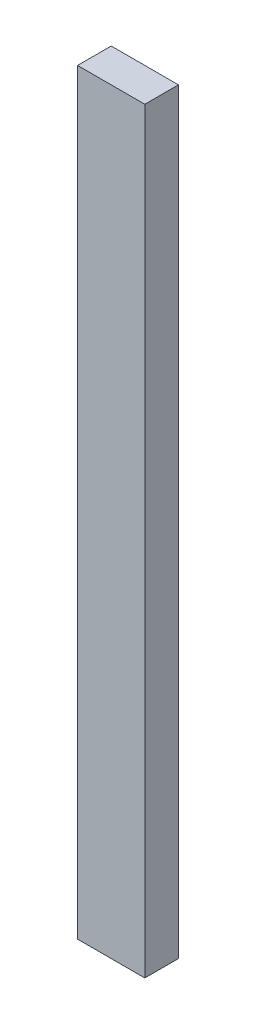
ISO-10303-21;
HEADER;
FILE_DESCRIPTION(('STEP AP214'),'2;1');
FILE_NAME('part.step','',(''),(''),'','','');
FILE_SCHEMA(('AUTOMOTIVE_DESIGN { 1 0 10303 214 1 1 1 1 }'));
ENDSEC;
DATA;
#1=APPLICATION_CONTEXT('core data for automotive mechanical design processes');
#2=APPLICATION_PROTOCOL_DEFINITION('international standard','automotive_design',2000,#1);
#3=PRODUCT_CONTEXT('',#1,'mechanical');
#4=PRODUCT('Part','Part','',(#3));
#5=PRODUCT_RELATED_PRODUCT_CATEGORY('part','',(#4));
#6=PRODUCT_DEFINITION_FORMATION('','',#4);
#7=PRODUCT_DEFINITION_CONTEXT('part definition',#1,'design');
#8=PRODUCT_DEFINITION('design','',#6,#7);
#9=PRODUCT_DEFINITION_SHAPE('','',#8);
#10=(LENGTH_UNIT() NAMED_UNIT(*) SI_UNIT(.MILLI.,.METRE.));
#11=(NAMED_UNIT(*) PLANE_ANGLE_UNIT() SI_UNIT($,.RADIAN.));
#12=(NAMED_UNIT(*) SI_UNIT($,.STERADIAN.) SOLID_ANGLE_UNIT());
#13=UNCERTAINTY_MEASURE_WITH_UNIT(LENGTH_MEASURE(1.E-05),#10,'distance_accuracy_value','');
#14=(GEOMETRIC_REPRESENTATION_CONTEXT(3) GLOBAL_UNCERTAINTY_ASSIGNED_CONTEXT((#13)) GLOBAL_UNIT_ASSIGNED_CONTEXT((#10,
#11,#12)) REPRESENTATION_CONTEXT('',''));
#15=CARTESIAN_POINT('',(0.,0.,0.));
#16=DIRECTION('',(0.,0.,1.));
#17=DIRECTION('',(1.,0.,0.));
#18=AXIS2_PLACEMENT_3D('',#15,#16,#17);
#19=CARTESIAN_POINT('',(0.,450.,0.));
#20=DIRECTION('',(1.,0.,0.));
#21=DIRECTION('',(0.,0.,-1.));
#22=AXIS2_PLACEMENT_3D('',#19,#20,#21);
#23=PLANE('',#22);
#24=DIRECTION('',(0.,0.,1.));
#25=VECTOR('',#24,1.);
#26=CARTESIAN_POINT('',(0.,0.,0.));
#27=LINE('',#26,#25);
#28=CARTESIAN_POINT('',(0.,0.,-20.));
#29=VERTEX_POINT('',#28);
#30=CARTESIAN_POINT('',(0.,0.,0.));
#31=VERTEX_POINT('',#30);
#32=EDGE_CURVE('E97',#29,#31,#27,.T.);
#33=ORIENTED_EDGE('',*,*,#32,.T.);
#34=DIRECTION('',(0.,-1.,0.));
#35=VECTOR('',#34,1.);
#36=CARTESIAN_POINT('',(0.,450.,0.));
#37=LINE('',#36,#35);
#38=CARTESIAN_POINT('',(0.,450.,0.));
#39=VERTEX_POINT('',#38);
#40=EDGE_CURVE('E11',#39,#31,#37,.T.);
#41=ORIENTED_EDGE('',*,*,#40,.F.);
#42=DIRECTION('',(0.,0.,1.));
#43=VECTOR('',#42,1.);
#44=CARTESIAN_POINT('',(0.,450.,0.));
#45=LINE('',#44,#43);
#46=CARTESIAN_POINT('',(0.,450.,-20.));
#47=VERTEX_POINT('',#46);
#48=EDGE_CURVE('E85',#47,#39,#45,.T.);
#49=ORIENTED_EDGE('',*,*,#48,.F.);
#50=DIRECTION('',(0.,-1.,0.));
#51=VECTOR('',#50,1.);
#52=CARTESIAN_POINT('',(0.,450.,-20.));
#53=LINE('',#52,#51);
#54=EDGE_CURVE('E93',#47,#29,#53,.T.);
#55=ORIENTED_EDGE('',*,*,#54,.T.);
#56=EDGE_LOOP('',(#33,#41,#49,#55));
#57=FACE_BOUND('',#56,.T.);
#58=ADVANCED_FACE('F34',(#57),#23,.F.);
#59=CARTESIAN_POINT('',(0.,450.,0.));
#60=DIRECTION('',(0.,0.,-1.));
#61=DIRECTION('',(-1.,0.,0.));
#62=AXIS2_PLACEMENT_3D('',#59,#60,#61);
#63=PLANE('',#62);
#64=DIRECTION('',(1.,0.,0.));
#65=VECTOR('',#64,1.);
#66=CARTESIAN_POINT('',(0.,0.,0.));
#67=LINE('',#66,#65);
#68=CARTESIAN_POINT('',(40.,0.,0.));
#69=VERTEX_POINT('',#68);
#70=EDGE_CURVE('E89',#31,#69,#67,.T.);
#71=ORIENTED_EDGE('',*,*,#70,.T.);
#72=DIRECTION('',(0.,-1.,0.));
#73=VECTOR('',#72,1.);
#74=CARTESIAN_POINT('',(40.,450.,0.));
#75=LINE('',#74,#73);
#76=CARTESIAN_POINT('',(40.,450.,0.));
#77=VERTEX_POINT('',#76);
#78=EDGE_CURVE('E42',#77,#69,#75,.T.);
#79=ORIENTED_EDGE('',*,*,#78,.F.);
#80=DIRECTION('',(1.,0.,0.));
#81=VECTOR('',#80,1.);
#82=CARTESIAN_POINT('',(0.,450.,0.));
#83=LINE('',#82,#81);
#84=EDGE_CURVE('E80',#39,#77,#83,.T.);
#85=ORIENTED_EDGE('',*,*,#84,.F.);
#86=ORIENTED_EDGE('',*,*,#40,.T.);
#87=EDGE_LOOP('',(#71,#79,#85,#86));
#88=FACE_BOUND('',#87,.T.);
#89=ADVANCED_FACE('F88',(#88),#63,.F.);
#90=CARTESIAN_POINT('',(40.,450.,0.));
#91=DIRECTION('',(-1.,0.,0.));
#92=DIRECTION('',(0.,0.,1.));
#93=AXIS2_PLACEMENT_3D('',#90,#91,#92);
#94=PLANE('',#93);
#95=DIRECTION('',(0.,0.,-1.));
#96=VECTOR('',#95,1.);
#97=CARTESIAN_POINT('',(40.,0.,0.));
#98=LINE('',#97,#96);
#99=CARTESIAN_POINT('',(40.,0.,-20.));
#100=VERTEX_POINT('',#99);
#101=EDGE_CURVE('E67',#69,#100,#98,.T.);
#102=ORIENTED_EDGE('',*,*,#101,.T.);
#103=DIRECTION('',(0.,-1.,0.));
#104=VECTOR('',#103,1.);
#105=CARTESIAN_POINT('',(40.,450.,-20.));
#106=LINE('',#105,#104);
#107=CARTESIAN_POINT('',(40.,450.,-20.));
#108=VERTEX_POINT('',#107);
#109=EDGE_CURVE('E90',#108,#100,#106,.T.);
#110=ORIENTED_EDGE('',*,*,#109,.F.);
#111=DIRECTION('',(0.,0.,-1.));
#112=VECTOR('',#111,1.);
#113=CARTESIAN_POINT('',(40.,450.,0.));
#114=LINE('',#113,#112);
#115=EDGE_CURVE('E83',#77,#108,#114,.T.);
#116=ORIENTED_EDGE('',*,*,#115,.F.);
#117=ORIENTED_EDGE('',*,*,#78,.T.);
#118=EDGE_LOOP('',(#102,#110,#116,#117));
#119=FACE_BOUND('',#118,.T.);
#120=ADVANCED_FACE('F91',(#119),#94,.F.);
#121=CARTESIAN_POINT('',(0.,450.,-20.));
#122=DIRECTION('',(0.,0.,1.));
#123=DIRECTION('',(1.,0.,0.));
#124=AXIS2_PLACEMENT_3D('',#121,#122,#123);
#125=PLANE('',#124);
#126=DIRECTION('',(-1.,0.,0.));
#127=VECTOR('',#126,1.);
#128=CARTESIAN_POINT('',(0.,0.,-20.));
#129=LINE('',#128,#127);
#130=EDGE_CURVE('E73',#100,#29,#129,.T.);
#131=ORIENTED_EDGE('',*,*,#130,.T.);
#132=ORIENTED_EDGE('',*,*,#54,.F.);
#133=DIRECTION('',(-1.,0.,0.));
#134=VECTOR('',#133,1.);
#135=CARTESIAN_POINT('',(0.,450.,-20.));
#136=LINE('',#135,#134);
#137=EDGE_CURVE('E50',#108,#47,#136,.T.);
#138=ORIENTED_EDGE('',*,*,#137,.F.);
#139=ORIENTED_EDGE('',*,*,#109,.T.);
#140=EDGE_LOOP('',(#131,#132,#138,#139));
#141=FACE_BOUND('',#140,.T.);
#142=ADVANCED_FACE('F104',(#141),#125,.F.);
#143=CARTESIAN_POINT('',(0.,450.,0.));
#144=DIRECTION('',(0.,-1.,0.));
#145=DIRECTION('',(0.,0.,-1.));
#146=AXIS2_PLACEMENT_3D('',#143,#144,#145);
#147=PLANE('',#146);
#148=ORIENTED_EDGE('',*,*,#48,.T.);
#149=ORIENTED_EDGE('',*,*,#84,.T.);
#150=ORIENTED_EDGE('',*,*,#115,.T.);
#151=ORIENTED_EDGE('',*,*,#137,.T.);
#152=EDGE_LOOP('',(#148,#149,#150,#151));
#153=FACE_BOUND('',#152,.T.);
#154=ADVANCED_FACE('F81',(#153),#147,.F.);
#155=CARTESIAN_POINT('',(0.,0.,0.));
#156=DIRECTION('',(0.,-1.,0.));
#157=DIRECTION('',(0.,0.,-1.));
#158=AXIS2_PLACEMENT_3D('',#155,#156,#157);
#159=PLANE('',#158);
#160=ORIENTED_EDGE('',*,*,#32,.F.);
#161=ORIENTED_EDGE('',*,*,#130,.F.);
#162=ORIENTED_EDGE('',*,*,#101,.F.);
#163=ORIENTED_EDGE('',*,*,#70,.F.);
#164=EDGE_LOOP('',(#160,#161,#162,#163));
#165=FACE_BOUND('',#164,.T.);
#166=ADVANCED_FACE('F107',(#165),#159,.T.);
#167=CLOSED_SHELL('',(#58,#89,#120,#142,#154,#166));
#168=MANIFOLD_SOLID_BREP('B2',#167);
#169=ADVANCED_BREP_SHAPE_REPRESENTATION('',(#18,#168),#14);
#170=SHAPE_DEFINITION_REPRESENTATION(#9,#169);
ENDSEC;
END-ISO-10303-21;
